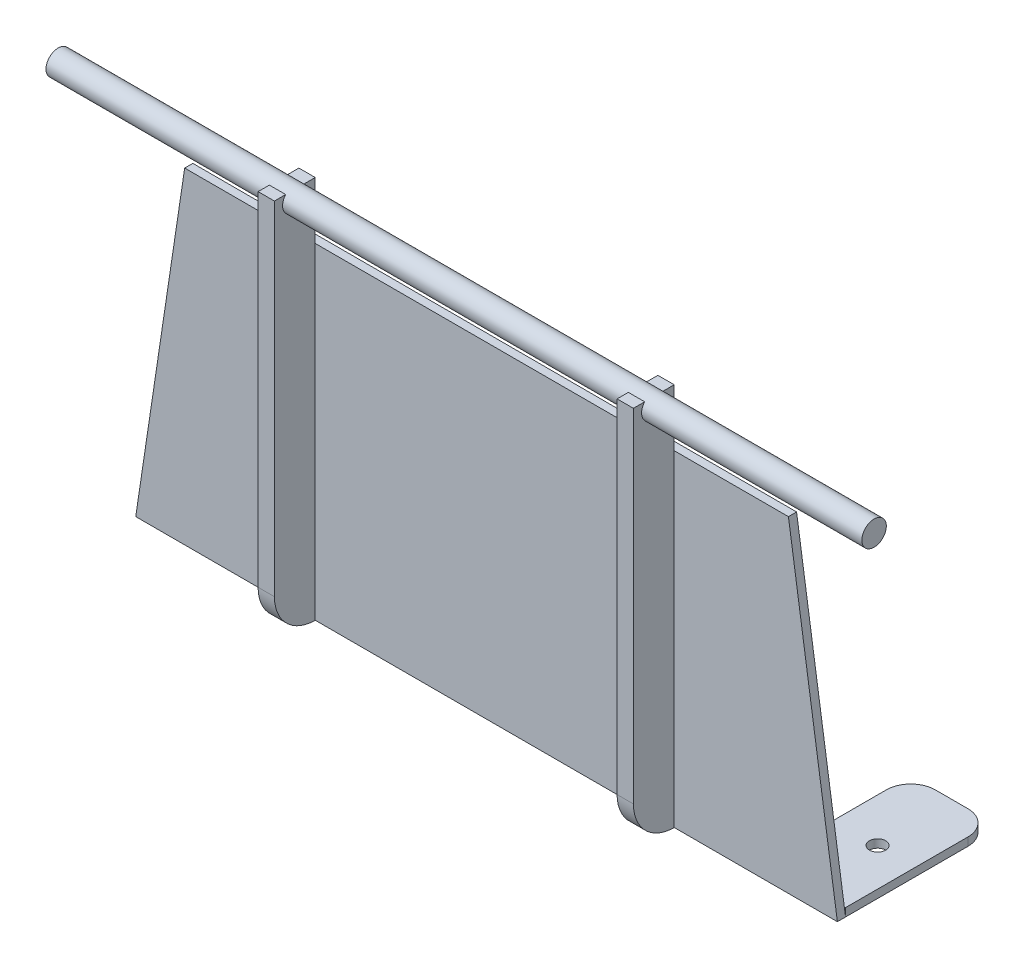
ISO-10303-21;
HEADER;
FILE_DESCRIPTION(('STEP AP214'),'2;1');
FILE_NAME('part.step','',(''),(''),'','','');
FILE_SCHEMA(('AUTOMOTIVE_DESIGN { 1 0 10303 214 1 1 1 1 }'));
ENDSEC;
DATA;
#1=APPLICATION_CONTEXT('core data for automotive mechanical design processes');
#2=APPLICATION_PROTOCOL_DEFINITION('international standard','automotive_design',2000,#1);
#3=PRODUCT_CONTEXT('',#1,'mechanical');
#4=PRODUCT('Part','Part','',(#3));
#5=PRODUCT_RELATED_PRODUCT_CATEGORY('part','',(#4));
#6=PRODUCT_DEFINITION_FORMATION('','',#4);
#7=PRODUCT_DEFINITION_CONTEXT('part definition',#1,'design');
#8=PRODUCT_DEFINITION('design','',#6,#7);
#9=PRODUCT_DEFINITION_SHAPE('','',#8);
#10=(LENGTH_UNIT() NAMED_UNIT(*) SI_UNIT(.MILLI.,.METRE.));
#11=(NAMED_UNIT(*) PLANE_ANGLE_UNIT() SI_UNIT($,.RADIAN.));
#12=(NAMED_UNIT(*) SI_UNIT($,.STERADIAN.) SOLID_ANGLE_UNIT());
#13=UNCERTAINTY_MEASURE_WITH_UNIT(LENGTH_MEASURE(1.E-05),#10,'distance_accuracy_value','');
#14=(GEOMETRIC_REPRESENTATION_CONTEXT(3) GLOBAL_UNCERTAINTY_ASSIGNED_CONTEXT((#13)) GLOBAL_UNIT_ASSIGNED_CONTEXT((#10,
#11,#12)) REPRESENTATION_CONTEXT('',''));
#15=CARTESIAN_POINT('',(0.,0.,0.));
#16=DIRECTION('',(0.,0.,1.));
#17=DIRECTION('',(1.,0.,0.));
#18=AXIS2_PLACEMENT_3D('',#15,#16,#17);
#19=CARTESIAN_POINT('',(0.,0.,0.));
#20=DIRECTION('',(0.,0.,1.));
#21=DIRECTION('',(1.,0.,0.));
#22=AXIS2_PLACEMENT_3D('',#19,#20,#21);
#23=PLANE('',#22);
#24=DIRECTION('',(-1.,0.,0.));
#25=VECTOR('',#24,1.);
#26=CARTESIAN_POINT('',(33.,1.,0.));
#27=LINE('',#26,#25);
#28=CARTESIAN_POINT('',(42.85,1.,0.));
#29=VERTEX_POINT('',#28);
#30=CARTESIAN_POINT('',(33.,1.,0.));
#31=VERTEX_POINT('',#30);
#32=EDGE_CURVE('E258',#29,#31,#27,.T.);
#33=ORIENTED_EDGE('',*,*,#32,.T.);
#34=DIRECTION('',(0.,-1.,0.));
#35=VECTOR('',#34,1.);
#36=CARTESIAN_POINT('',(33.,1.,0.));
#37=LINE('',#36,#35);
#38=CARTESIAN_POINT('',(33.,0.,0.));
#39=VERTEX_POINT('',#38);
#40=EDGE_CURVE('E253',#31,#39,#37,.T.);
#41=ORIENTED_EDGE('',*,*,#40,.T.);
#42=DIRECTION('',(1.,0.,0.));
#43=VECTOR('',#42,1.);
#44=CARTESIAN_POINT('',(-43.,0.,0.));
#45=LINE('',#44,#43);
#46=CARTESIAN_POINT('',(-33.,0.,0.));
#47=VERTEX_POINT('',#46);
#48=EDGE_CURVE('E458',#47,#39,#45,.T.);
#49=ORIENTED_EDGE('',*,*,#48,.F.);
#50=DIRECTION('',(0.,-1.,0.));
#51=VECTOR('',#50,1.);
#52=CARTESIAN_POINT('',(-33.,1.,0.));
#53=LINE('',#52,#51);
#54=CARTESIAN_POINT('',(-33.,1.,0.));
#55=VERTEX_POINT('',#54);
#56=EDGE_CURVE('E326',#55,#47,#53,.T.);
#57=ORIENTED_EDGE('',*,*,#56,.F.);
#58=DIRECTION('',(1.,0.,0.));
#59=VECTOR('',#58,1.);
#60=CARTESIAN_POINT('',(-33.,1.,0.));
#61=LINE('',#60,#59);
#62=CARTESIAN_POINT('',(-42.85,1.,0.));
#63=VERTEX_POINT('',#62);
#64=EDGE_CURVE('E302',#63,#55,#61,.T.);
#65=ORIENTED_EDGE('',*,*,#64,.F.);
#66=DIRECTION('',(-0.148340452930245,-0.988936352868298,0.));
#67=VECTOR('',#66,1.);
#68=CARTESIAN_POINT('',(-37.,40.,0.));
#69=LINE('',#68,#67);
#70=CARTESIAN_POINT('',(-37.,40.,0.));
#71=VERTEX_POINT('',#70);
#72=EDGE_CURVE('E454',#71,#63,#69,.T.);
#73=ORIENTED_EDGE('',*,*,#72,.F.);
#74=DIRECTION('',(-1.,0.,0.));
#75=VECTOR('',#74,1.);
#76=CARTESIAN_POINT('',(37.,40.,0.));
#77=LINE('',#76,#75);
#78=CARTESIAN_POINT('',(37.,40.,0.));
#79=VERTEX_POINT('',#78);
#80=EDGE_CURVE('E439',#79,#71,#77,.T.);
#81=ORIENTED_EDGE('',*,*,#80,.F.);
#82=DIRECTION('',(-0.148340452930245,0.988936352868298,0.));
#83=VECTOR('',#82,1.);
#84=CARTESIAN_POINT('',(37.,40.,0.));
#85=LINE('',#84,#83);
#86=EDGE_CURVE('E462',#29,#79,#85,.T.);
#87=ORIENTED_EDGE('',*,*,#86,.F.);
#88=EDGE_LOOP('',(#33,#41,#49,#57,#65,#73,#81,#87));
#89=FACE_BOUND('',#88,.T.);
#90=ADVANCED_FACE('F39',(#89),#23,.F.);
#91=CARTESIAN_POINT('',(23.,47.,1.00000000000001));
#92=DIRECTION('',(0.,-1.,0.));
#93=DIRECTION('',(0.,0.,-1.));
#94=AXIS2_PLACEMENT_3D('',#91,#92,#93);
#95=PLANE('',#94);
#96=DIRECTION('',(0.,0.,1.));
#97=VECTOR('',#96,1.);
#98=CARTESIAN_POINT('',(21.,47.,1.00000000000001));
#99=LINE('',#98,#97);
#100=CARTESIAN_POINT('',(21.,47.,1.00000000000001));
#101=VERTEX_POINT('',#100);
#102=CARTESIAN_POINT('',(21.,47.,2.38196601125011));
#103=VERTEX_POINT('',#102);
#104=EDGE_CURVE('E418',#101,#103,#99,.T.);
#105=ORIENTED_EDGE('',*,*,#104,.T.);
#106=DIRECTION('',(1.,0.,0.));
#107=VECTOR('',#106,1.);
#108=CARTESIAN_POINT('',(-50.,47.,2.38196601125011));
#109=LINE('',#108,#107);
#110=CARTESIAN_POINT('',(23.,47.,2.38196601125011));
#111=VERTEX_POINT('',#110);
#112=EDGE_CURVE('E357',#103,#111,#109,.T.);
#113=ORIENTED_EDGE('',*,*,#112,.T.);
#114=DIRECTION('',(0.,0.,1.));
#115=VECTOR('',#114,1.);
#116=CARTESIAN_POINT('',(23.,47.,1.00000000000001));
#117=LINE('',#116,#115);
#118=CARTESIAN_POINT('',(23.,47.,1.00000000000001));
#119=VERTEX_POINT('',#118);
#120=EDGE_CURVE('E405',#119,#111,#117,.T.);
#121=ORIENTED_EDGE('',*,*,#120,.F.);
#122=DIRECTION('',(-1.,0.,0.));
#123=VECTOR('',#122,1.);
#124=CARTESIAN_POINT('',(23.,47.,1.00000000000001));
#125=LINE('',#124,#123);
#126=EDGE_CURVE('E429',#119,#101,#125,.T.);
#127=ORIENTED_EDGE('',*,*,#126,.T.);
#128=EDGE_LOOP('',(#105,#113,#121,#127));
#129=FACE_BOUND('',#128,.T.);
#130=ADVANCED_FACE('F702',(#129),#95,.F.);
#131=CARTESIAN_POINT('',(-23.,47.,1.00000000000001));
#132=DIRECTION('',(0.,1.,0.));
#133=DIRECTION('',(0.,0.,1.));
#134=AXIS2_PLACEMENT_3D('',#131,#132,#133);
#135=PLANE('',#134);
#136=DIRECTION('',(1.,0.,0.));
#137=VECTOR('',#136,1.);
#138=CARTESIAN_POINT('',(-50.,47.,4.6180339887499));
#139=LINE('',#138,#137);
#140=CARTESIAN_POINT('',(-23.,47.,4.6180339887499));
#141=VERTEX_POINT('',#140);
#142=CARTESIAN_POINT('',(-21.,47.,4.6180339887499));
#143=VERTEX_POINT('',#142);
#144=EDGE_CURVE('E342',#141,#143,#139,.T.);
#145=ORIENTED_EDGE('',*,*,#144,.F.);
#146=DIRECTION('',(0.,0.,1.));
#147=VECTOR('',#146,1.);
#148=CARTESIAN_POINT('',(-23.,47.,1.00000000000001));
#149=LINE('',#148,#147);
#150=CARTESIAN_POINT('',(-23.,47.,6.));
#151=VERTEX_POINT('',#150);
#152=EDGE_CURVE('E368',#141,#151,#149,.T.);
#153=ORIENTED_EDGE('',*,*,#152,.T.);
#154=DIRECTION('',(1.,0.,0.));
#155=VECTOR('',#154,1.);
#156=CARTESIAN_POINT('',(-23.,47.,6.));
#157=LINE('',#156,#155);
#158=CARTESIAN_POINT('',(-21.,47.,6.));
#159=VERTEX_POINT('',#158);
#160=EDGE_CURVE('E394',#151,#159,#157,.T.);
#161=ORIENTED_EDGE('',*,*,#160,.T.);
#162=DIRECTION('',(0.,0.,1.));
#163=VECTOR('',#162,1.);
#164=CARTESIAN_POINT('',(-21.,47.,1.00000000000001));
#165=LINE('',#164,#163);
#166=EDGE_CURVE('E383',#143,#159,#165,.T.);
#167=ORIENTED_EDGE('',*,*,#166,.F.);
#168=EDGE_LOOP('',(#145,#153,#161,#167));
#169=FACE_BOUND('',#168,.T.);
#170=ADVANCED_FACE('F617',(#169),#135,.T.);
#171=CARTESIAN_POINT('',(0.,0.,1.));
#172=DIRECTION('',(0.,0.,1.));
#173=DIRECTION('',(1.,0.,0.));
#174=AXIS2_PLACEMENT_3D('',#171,#172,#173);
#175=PLANE('',#174);
#176=DIRECTION('',(1.,0.,0.));
#177=VECTOR('',#176,1.);
#178=CARTESIAN_POINT('',(-43.,0.,1.));
#179=LINE('',#178,#177);
#180=CARTESIAN_POINT('',(-43.,0.,1.));
#181=VERTEX_POINT('',#180);
#182=CARTESIAN_POINT('',(-23.,0.,1.));
#183=VERTEX_POINT('',#182);
#184=EDGE_CURVE('E440',#181,#183,#179,.T.);
#185=ORIENTED_EDGE('',*,*,#184,.T.);
#186=DIRECTION('',(0.,1.,0.));
#187=VECTOR('',#186,1.);
#188=CARTESIAN_POINT('',(-23.,47.,1.00000000000001));
#189=LINE('',#188,#187);
#190=CARTESIAN_POINT('',(-23.,40.,1.00000000000001));
#191=VERTEX_POINT('',#190);
#192=EDGE_CURVE('E375',#183,#191,#189,.T.);
#193=ORIENTED_EDGE('',*,*,#192,.T.);
#194=DIRECTION('',(-1.,0.,0.));
#195=VECTOR('',#194,1.);
#196=CARTESIAN_POINT('',(37.,40.,1.));
#197=LINE('',#196,#195);
#198=CARTESIAN_POINT('',(-37.,40.,1.));
#199=VERTEX_POINT('',#198);
#200=EDGE_CURVE('E448',#191,#199,#197,.T.);
#201=ORIENTED_EDGE('',*,*,#200,.T.);
#202=DIRECTION('',(-0.148340452930245,-0.988936352868298,0.));
#203=VECTOR('',#202,1.);
#204=CARTESIAN_POINT('',(-37.,40.,1.));
#205=LINE('',#204,#203);
#206=EDGE_CURVE('E434',#199,#181,#205,.T.);
#207=ORIENTED_EDGE('',*,*,#206,.T.);
#208=EDGE_LOOP('',(#185,#193,#201,#207));
#209=FACE_BOUND('',#208,.T.);
#210=ADVANCED_FACE('F645',(#209),#175,.T.);
#211=DIRECTION('',(0.,1.,0.));
#212=VECTOR('',#211,1.);
#213=CARTESIAN_POINT('',(-21.,47.,1.00000000000001));
#214=LINE('',#213,#212);
#215=CARTESIAN_POINT('',(-21.,0.,1.));
#216=VERTEX_POINT('',#215);
#217=CARTESIAN_POINT('',(-21.,40.,1.));
#218=VERTEX_POINT('',#217);
#219=EDGE_CURVE('E369',#216,#218,#214,.T.);
#220=ORIENTED_EDGE('',*,*,#219,.F.);
#221=CARTESIAN_POINT('',(21.,0.,1.));
#222=VERTEX_POINT('',#221);
#223=EDGE_CURVE('E445',#216,#222,#179,.T.);
#224=ORIENTED_EDGE('',*,*,#223,.T.);
#225=DIRECTION('',(0.,1.,0.));
#226=VECTOR('',#225,1.);
#227=CARTESIAN_POINT('',(21.,47.,1.00000000000001));
#228=LINE('',#227,#226);
#229=CARTESIAN_POINT('',(21.,40.,1.));
#230=VERTEX_POINT('',#229);
#231=EDGE_CURVE('E414',#222,#230,#228,.T.);
#232=ORIENTED_EDGE('',*,*,#231,.T.);
#233=EDGE_CURVE('E650',#230,#218,#197,.T.);
#234=ORIENTED_EDGE('',*,*,#233,.T.);
#235=EDGE_LOOP('',(#220,#224,#232,#234));
#236=FACE_BOUND('',#235,.T.);
#237=ADVANCED_FACE('F588',(#236),#175,.T.);
#238=CARTESIAN_POINT('',(-37.,40.,1.));
#239=DIRECTION('',(0.988936352868298,-0.148340452930245,0.));
#240=DIRECTION('',(0.148340452930245,0.988936352868298,0.));
#241=AXIS2_PLACEMENT_3D('',#238,#239,#240);
#242=PLANE('',#241);
#243=ORIENTED_EDGE('',*,*,#72,.T.);
#244=CARTESIAN_POINT('',(-43.,0.,0.));
#245=VERTEX_POINT('',#244);
#246=EDGE_CURVE('E433',#63,#245,#69,.T.);
#247=ORIENTED_EDGE('',*,*,#246,.T.);
#248=DIRECTION('',(0.,0.,-1.));
#249=VECTOR('',#248,1.);
#250=CARTESIAN_POINT('',(-43.,0.,1.));
#251=LINE('',#250,#249);
#252=EDGE_CURVE('E477',#181,#245,#251,.T.);
#253=ORIENTED_EDGE('',*,*,#252,.F.);
#254=ORIENTED_EDGE('',*,*,#206,.F.);
#255=DIRECTION('',(0.,0.,-1.));
#256=VECTOR('',#255,1.);
#257=CARTESIAN_POINT('',(-37.,40.,1.));
#258=LINE('',#257,#256);
#259=EDGE_CURVE('E452',#199,#71,#258,.T.);
#260=ORIENTED_EDGE('',*,*,#259,.T.);
#261=EDGE_LOOP('',(#243,#247,#253,#254,#260));
#262=FACE_BOUND('',#261,.T.);
#263=ADVANCED_FACE('F664',(#262),#242,.F.);
#264=CARTESIAN_POINT('',(-43.,0.,1.));
#265=DIRECTION('',(0.,1.,0.));
#266=DIRECTION('',(-1.,0.,0.));
#267=AXIS2_PLACEMENT_3D('',#264,#265,#266);
#268=PLANE('',#267);
#269=CARTESIAN_POINT('',(38.3643398282202,0.,-8.56066017177982));
#270=DIRECTION('',(0.,-1.,0.));
#271=DIRECTION('',(0.,0.,1.));
#272=AXIS2_PLACEMENT_3D('',#269,#270,#271);
#273=CIRCLE('',#272,0.999999999999998);
#274=CARTESIAN_POINT('',(38.3643398282202,0.,-7.56066017177983));
#275=VERTEX_POINT('',#274);
#276=EDGE_CURVE('E278',#275,#275,#273,.T.);
#277=ORIENTED_EDGE('',*,*,#276,.F.);
#278=EDGE_LOOP('',(#277));
#279=FACE_BOUND('',#278,.T.);
#280=CARTESIAN_POINT('',(-38.3643398282202,0.,-8.56066017177982));
#281=DIRECTION('',(0.,1.,0.));
#282=DIRECTION('',(0.,0.,1.));
#283=AXIS2_PLACEMENT_3D('',#280,#281,#282);
#284=CIRCLE('',#283,0.999999999999998);
#285=CARTESIAN_POINT('',(-38.3643398282202,0.,-7.56066017177983));
#286=VERTEX_POINT('',#285);
#287=EDGE_CURVE('E288',#286,#286,#284,.T.);
#288=ORIENTED_EDGE('',*,*,#287,.T.);
#289=EDGE_LOOP('',(#288));
#290=FACE_BOUND('',#289,.T.);
#291=DIRECTION('',(0.,0.,-1.));
#292=VECTOR('',#291,1.);
#293=CARTESIAN_POINT('',(33.,0.,-18.));
#294=LINE('',#293,#292);
#295=CARTESIAN_POINT('',(33.,0.,-15.));
#296=VERTEX_POINT('',#295);
#297=EDGE_CURVE('E263',#39,#296,#294,.T.);
#298=ORIENTED_EDGE('',*,*,#297,.T.);
#299=CARTESIAN_POINT('',(36.,0.,-15.));
#300=DIRECTION('',(0.,1.,0.));
#301=DIRECTION('',(-1.,0.,0.));
#302=AXIS2_PLACEMENT_3D('',#299,#300,#301);
#303=CIRCLE('',#302,3.);
#304=CARTESIAN_POINT('',(36.,0.,-18.));
#305=VERTEX_POINT('',#304);
#306=EDGE_CURVE('E544',#296,#305,#303,.F.);
#307=ORIENTED_EDGE('',*,*,#306,.T.);
#308=DIRECTION('',(1.,0.,0.));
#309=VECTOR('',#308,1.);
#310=CARTESIAN_POINT('',(43.,0.,-18.));
#311=LINE('',#310,#309);
#312=CARTESIAN_POINT('',(40.,0.,-18.));
#313=VERTEX_POINT('',#312);
#314=EDGE_CURVE('E277',#305,#313,#311,.T.);
#315=ORIENTED_EDGE('',*,*,#314,.T.);
#316=CARTESIAN_POINT('',(40.,0.,-15.));
#317=DIRECTION('',(0.,1.,0.));
#318=DIRECTION('',(-1.,0.,0.));
#319=AXIS2_PLACEMENT_3D('',#316,#317,#318);
#320=CIRCLE('',#319,3.);
#321=CARTESIAN_POINT('',(43.,0.,-15.));
#322=VERTEX_POINT('',#321);
#323=EDGE_CURVE('E541',#313,#322,#320,.F.);
#324=ORIENTED_EDGE('',*,*,#323,.T.);
#325=DIRECTION('',(0.,0.,1.));
#326=VECTOR('',#325,1.);
#327=CARTESIAN_POINT('',(43.,0.,0.));
#328=LINE('',#327,#326);
#329=CARTESIAN_POINT('',(43.,0.,0.));
#330=VERTEX_POINT('',#329);
#331=EDGE_CURVE('E274',#322,#330,#328,.T.);
#332=ORIENTED_EDGE('',*,*,#331,.T.);
#333=DIRECTION('',(0.,0.,-1.));
#334=VECTOR('',#333,1.);
#335=CARTESIAN_POINT('',(43.,0.,1.));
#336=LINE('',#335,#334);
#337=CARTESIAN_POINT('',(43.,0.,1.));
#338=VERTEX_POINT('',#337);
#339=EDGE_CURVE('E474',#338,#330,#336,.T.);
#340=ORIENTED_EDGE('',*,*,#339,.F.);
#341=CARTESIAN_POINT('',(23.,0.,1.));
#342=VERTEX_POINT('',#341);
#343=EDGE_CURVE('E438',#342,#338,#179,.T.);
#344=ORIENTED_EDGE('',*,*,#343,.F.);
#345=DIRECTION('',(-1.,0.,0.));
#346=VECTOR('',#345,1.);
#347=CARTESIAN_POINT('',(-43.,0.,1.));
#348=LINE('',#347,#346);
#349=EDGE_CURVE('E481',#342,#222,#348,.T.);
#350=ORIENTED_EDGE('',*,*,#349,.T.);
#351=ORIENTED_EDGE('',*,*,#223,.F.);
#352=DIRECTION('',(1.,0.,0.));
#353=VECTOR('',#352,1.);
#354=CARTESIAN_POINT('',(-23.,0.,1.));
#355=LINE('',#354,#353);
#356=EDGE_CURVE('E501',#216,#183,#355,.F.);
#357=ORIENTED_EDGE('',*,*,#356,.T.);
#358=ORIENTED_EDGE('',*,*,#184,.F.);
#359=ORIENTED_EDGE('',*,*,#252,.T.);
#360=DIRECTION('',(0.,0.,1.));
#361=VECTOR('',#360,1.);
#362=CARTESIAN_POINT('',(-43.,0.,0.));
#363=LINE('',#362,#361);
#364=CARTESIAN_POINT('',(-43.,0.,-15.));
#365=VERTEX_POINT('',#364);
#366=EDGE_CURVE('E301',#365,#245,#363,.T.);
#367=ORIENTED_EDGE('',*,*,#366,.F.);
#368=CARTESIAN_POINT('',(-40.,0.,-15.));
#369=DIRECTION('',(0.,1.,0.));
#370=DIRECTION('',(-1.,0.,0.));
#371=AXIS2_PLACEMENT_3D('',#368,#369,#370);
#372=CIRCLE('',#371,3.);
#373=CARTESIAN_POINT('',(-40.,0.,-18.));
#374=VERTEX_POINT('',#373);
#375=EDGE_CURVE('E518',#365,#374,#372,.F.);
#376=ORIENTED_EDGE('',*,*,#375,.T.);
#377=DIRECTION('',(-1.,0.,0.));
#378=VECTOR('',#377,1.);
#379=CARTESIAN_POINT('',(-43.,0.,-18.));
#380=LINE('',#379,#378);
#381=CARTESIAN_POINT('',(-36.,0.,-18.));
#382=VERTEX_POINT('',#381);
#383=EDGE_CURVE('E317',#382,#374,#380,.T.);
#384=ORIENTED_EDGE('',*,*,#383,.F.);
#385=CARTESIAN_POINT('',(-36.,0.,-15.));
#386=DIRECTION('',(0.,1.,0.));
#387=DIRECTION('',(-1.,0.,0.));
#388=AXIS2_PLACEMENT_3D('',#385,#386,#387);
#389=CIRCLE('',#388,3.);
#390=CARTESIAN_POINT('',(-33.,0.,-15.));
#391=VERTEX_POINT('',#390);
#392=EDGE_CURVE('E521',#382,#391,#389,.F.);
#393=ORIENTED_EDGE('',*,*,#392,.T.);
#394=DIRECTION('',(0.,0.,-1.));
#395=VECTOR('',#394,1.);
#396=CARTESIAN_POINT('',(-33.,0.,-18.));
#397=LINE('',#396,#395);
#398=EDGE_CURVE('E292',#47,#391,#397,.T.);
#399=ORIENTED_EDGE('',*,*,#398,.F.);
#400=ORIENTED_EDGE('',*,*,#48,.T.);
#401=EDGE_LOOP('',(#298,#307,#315,#324,#332,#340,#344,#350,#351,#357,#358,#359,#367,#376,#384,
#393,#399,#400));
#402=FACE_BOUND('',#401,.T.);
#403=ADVANCED_FACE('F565',(#279,#290,#402),#268,.F.);
#404=CARTESIAN_POINT('',(37.,40.,1.));
#405=DIRECTION('',(-0.988936352868298,-0.148340452930245,0.));
#406=DIRECTION('',(0.148340452930245,-0.988936352868298,0.));
#407=AXIS2_PLACEMENT_3D('',#404,#405,#406);
#408=PLANE('',#407);
#409=EDGE_CURVE('E250',#330,#29,#85,.T.);
#410=ORIENTED_EDGE('',*,*,#409,.T.);
#411=ORIENTED_EDGE('',*,*,#86,.T.);
#412=DIRECTION('',(0.,0.,-1.));
#413=VECTOR('',#412,1.);
#414=CARTESIAN_POINT('',(37.,40.,1.));
#415=LINE('',#414,#413);
#416=CARTESIAN_POINT('',(37.,40.,1.));
#417=VERTEX_POINT('',#416);
#418=EDGE_CURVE('E470',#417,#79,#415,.T.);
#419=ORIENTED_EDGE('',*,*,#418,.F.);
#420=DIRECTION('',(-0.148340452930245,0.988936352868298,0.));
#421=VECTOR('',#420,1.);
#422=CARTESIAN_POINT('',(37.,40.,1.));
#423=LINE('',#422,#421);
#424=EDGE_CURVE('E444',#338,#417,#423,.T.);
#425=ORIENTED_EDGE('',*,*,#424,.F.);
#426=ORIENTED_EDGE('',*,*,#339,.T.);
#427=EDGE_LOOP('',(#410,#411,#419,#425,#426));
#428=FACE_BOUND('',#427,.T.);
#429=ADVANCED_FACE('F576',(#428),#408,.F.);
#430=CARTESIAN_POINT('',(37.,40.,1.));
#431=DIRECTION('',(0.,-1.,0.));
#432=DIRECTION('',(1.,0.,0.));
#433=AXIS2_PLACEMENT_3D('',#430,#431,#432);
#434=PLANE('',#433);
#435=ORIENTED_EDGE('',*,*,#80,.T.);
#436=ORIENTED_EDGE('',*,*,#259,.F.);
#437=ORIENTED_EDGE('',*,*,#200,.F.);
#438=EDGE_CURVE('E647',#218,#191,#197,.T.);
#439=ORIENTED_EDGE('',*,*,#438,.F.);
#440=ORIENTED_EDGE('',*,*,#233,.F.);
#441=CARTESIAN_POINT('',(23.,40.,1.00000000000001));
#442=VERTEX_POINT('',#441);
#443=EDGE_CURVE('E453',#442,#230,#197,.T.);
#444=ORIENTED_EDGE('',*,*,#443,.F.);
#445=EDGE_CURVE('E449',#417,#442,#197,.T.);
#446=ORIENTED_EDGE('',*,*,#445,.F.);
#447=ORIENTED_EDGE('',*,*,#418,.T.);
#448=EDGE_LOOP('',(#435,#436,#437,#439,#440,#444,#446,#447));
#449=FACE_BOUND('',#448,.T.);
#450=ADVANCED_FACE('F656',(#449),#434,.F.);
#451=DIRECTION('',(0.,1.,0.));
#452=VECTOR('',#451,1.);
#453=CARTESIAN_POINT('',(23.,47.,1.00000000000001));
#454=LINE('',#453,#452);
#455=EDGE_CURVE('E399',#342,#442,#454,.T.);
#456=ORIENTED_EDGE('',*,*,#455,.F.);
#457=ORIENTED_EDGE('',*,*,#343,.T.);
#458=ORIENTED_EDGE('',*,*,#424,.T.);
#459=ORIENTED_EDGE('',*,*,#445,.T.);
#460=EDGE_LOOP('',(#456,#457,#458,#459));
#461=FACE_BOUND('',#460,.T.);
#462=ADVANCED_FACE('F580',(#461),#175,.T.);
#463=CARTESIAN_POINT('',(23.,47.,1.00000000000001));
#464=DIRECTION('',(0.,0.,1.));
#465=DIRECTION('',(0.,-1.,0.));
#466=AXIS2_PLACEMENT_3D('',#463,#464,#465);
#467=PLANE('',#466);
#468=EDGE_CURVE('E404',#442,#119,#454,.T.);
#469=ORIENTED_EDGE('',*,*,#468,.F.);
#470=ORIENTED_EDGE('',*,*,#443,.T.);
#471=EDGE_CURVE('E398',#230,#101,#228,.T.);
#472=ORIENTED_EDGE('',*,*,#471,.T.);
#473=ORIENTED_EDGE('',*,*,#126,.F.);
#474=EDGE_LOOP('',(#469,#470,#472,#473));
#475=FACE_BOUND('',#474,.T.);
#476=ADVANCED_FACE('F655',(#475),#467,.F.);
#477=CARTESIAN_POINT('',(23.,47.,4.6180339887499));
#478=VERTEX_POINT('',#477);
#479=CARTESIAN_POINT('',(23.,47.,6.));
#480=VERTEX_POINT('',#479);
#481=EDGE_CURVE('E403',#478,#480,#117,.T.);
#482=ORIENTED_EDGE('',*,*,#481,.F.);
#483=DIRECTION('',(1.,0.,0.));
#484=VECTOR('',#483,1.);
#485=CARTESIAN_POINT('',(-50.,47.,4.6180339887499));
#486=LINE('',#485,#484);
#487=CARTESIAN_POINT('',(21.,47.,4.6180339887499));
#488=VERTEX_POINT('',#487);
#489=EDGE_CURVE('E353',#478,#488,#486,.F.);
#490=ORIENTED_EDGE('',*,*,#489,.T.);
#491=CARTESIAN_POINT('',(21.,47.,6.));
#492=VERTEX_POINT('',#491);
#493=EDGE_CURVE('E417',#488,#492,#99,.T.);
#494=ORIENTED_EDGE('',*,*,#493,.T.);
#495=DIRECTION('',(-1.,0.,0.));
#496=VECTOR('',#495,1.);
#497=CARTESIAN_POINT('',(23.,47.,6.));
#498=LINE('',#497,#496);
#499=EDGE_CURVE('E413',#480,#492,#498,.T.);
#500=ORIENTED_EDGE('',*,*,#499,.F.);
#501=EDGE_LOOP('',(#482,#490,#494,#500));
#502=FACE_BOUND('',#501,.T.);
#503=ADVANCED_FACE('F709',(#502),#95,.F.);
#504=CARTESIAN_POINT('',(23.,0.,6.));
#505=DIRECTION('',(0.,0.,-1.));
#506=DIRECTION('',(-1.,0.,0.));
#507=AXIS2_PLACEMENT_3D('',#504,#505,#506);
#508=PLANE('',#507);
#509=DIRECTION('',(0.,-1.,0.));
#510=VECTOR('',#509,1.);
#511=CARTESIAN_POINT('',(21.,0.,6.));
#512=LINE('',#511,#510);
#513=CARTESIAN_POINT('',(21.,5.,6.));
#514=VERTEX_POINT('',#513);
#515=EDGE_CURVE('E422',#492,#514,#512,.T.);
#516=ORIENTED_EDGE('',*,*,#515,.T.);
#517=DIRECTION('',(-1.,0.,0.));
#518=VECTOR('',#517,1.);
#519=CARTESIAN_POINT('',(23.,5.,6.));
#520=LINE('',#519,#518);
#521=CARTESIAN_POINT('',(23.,5.,6.));
#522=VERTEX_POINT('',#521);
#523=EDGE_CURVE('E488',#514,#522,#520,.F.);
#524=ORIENTED_EDGE('',*,*,#523,.T.);
#525=DIRECTION('',(0.,-1.,0.));
#526=VECTOR('',#525,1.);
#527=CARTESIAN_POINT('',(23.,0.,6.));
#528=LINE('',#527,#526);
#529=EDGE_CURVE('E409',#480,#522,#528,.T.);
#530=ORIENTED_EDGE('',*,*,#529,.F.);
#531=ORIENTED_EDGE('',*,*,#499,.T.);
#532=EDGE_LOOP('',(#516,#524,#530,#531));
#533=FACE_BOUND('',#532,.T.);
#534=ADVANCED_FACE('F746',(#533),#508,.F.);
#535=CARTESIAN_POINT('',(23.,0.,0.));
#536=DIRECTION('',(-1.,0.,0.));
#537=DIRECTION('',(0.,0.,1.));
#538=AXIS2_PLACEMENT_3D('',#535,#536,#537);
#539=PLANE('',#538);
#540=ORIENTED_EDGE('',*,*,#120,.T.);
#541=CARTESIAN_POINT('',(23.,46.,3.5));
#542=DIRECTION('',(-1.,0.,0.));
#543=DIRECTION('',(0.,0.,1.));
#544=AXIS2_PLACEMENT_3D('',#541,#542,#543);
#545=CIRCLE('',#544,1.5);
#546=EDGE_CURVE('E360',#111,#478,#545,.T.);
#547=ORIENTED_EDGE('',*,*,#546,.T.);
#548=ORIENTED_EDGE('',*,*,#481,.T.);
#549=ORIENTED_EDGE('',*,*,#529,.T.);
#550=CARTESIAN_POINT('',(23.,5.,1.));
#551=DIRECTION('',(-1.,0.,0.));
#552=DIRECTION('',(0.,0.,1.));
#553=AXIS2_PLACEMENT_3D('',#550,#551,#552);
#554=CIRCLE('',#553,5.);
#555=EDGE_CURVE('E491',#522,#342,#554,.F.);
#556=ORIENTED_EDGE('',*,*,#555,.T.);
#557=ORIENTED_EDGE('',*,*,#455,.T.);
#558=ORIENTED_EDGE('',*,*,#468,.T.);
#559=EDGE_LOOP('',(#540,#547,#548,#549,#556,#557,#558));
#560=FACE_BOUND('',#559,.T.);
#561=ADVANCED_FACE('F743',(#560),#539,.F.);
#562=CARTESIAN_POINT('',(21.,0.,0.));
#563=DIRECTION('',(-1.,0.,0.));
#564=DIRECTION('',(0.,0.,1.));
#565=AXIS2_PLACEMENT_3D('',#562,#563,#564);
#566=PLANE('',#565);
#567=CARTESIAN_POINT('',(21.,46.,3.5));
#568=DIRECTION('',(-1.,0.,0.));
#569=DIRECTION('',(0.,0.,1.));
#570=AXIS2_PLACEMENT_3D('',#567,#568,#569);
#571=CIRCLE('',#570,1.5);
#572=EDGE_CURVE('E349',#103,#488,#571,.T.);
#573=ORIENTED_EDGE('',*,*,#572,.F.);
#574=ORIENTED_EDGE('',*,*,#104,.F.);
#575=ORIENTED_EDGE('',*,*,#471,.F.);
#576=ORIENTED_EDGE('',*,*,#231,.F.);
#577=CARTESIAN_POINT('',(21.,5.,1.));
#578=DIRECTION('',(-1.,0.,0.));
#579=DIRECTION('',(0.,0.,1.));
#580=AXIS2_PLACEMENT_3D('',#577,#578,#579);
#581=CIRCLE('',#580,5.);
#582=EDGE_CURVE('E485',#222,#514,#581,.T.);
#583=ORIENTED_EDGE('',*,*,#582,.T.);
#584=ORIENTED_EDGE('',*,*,#515,.F.);
#585=ORIENTED_EDGE('',*,*,#493,.F.);
#586=EDGE_LOOP('',(#573,#574,#575,#576,#583,#584,#585));
#587=FACE_BOUND('',#586,.T.);
#588=ADVANCED_FACE('F600',(#587),#566,.T.);
#589=CARTESIAN_POINT('',(-43.,5.,1.));
#590=DIRECTION('',(-1.,0.,0.));
#591=DIRECTION('',(0.,-1.,0.));
#592=AXIS2_PLACEMENT_3D('',#589,#590,#591);
#593=CYLINDRICAL_SURFACE('',#592,5.);
#594=ORIENTED_EDGE('',*,*,#555,.F.);
#595=ORIENTED_EDGE('',*,*,#523,.F.);
#596=ORIENTED_EDGE('',*,*,#582,.F.);
#597=ORIENTED_EDGE('',*,*,#349,.F.);
#598=EDGE_LOOP('',(#594,#595,#596,#597));
#599=FACE_BOUND('',#598,.T.);
#600=ADVANCED_FACE('F596',(#599),#593,.T.);
#601=CARTESIAN_POINT('',(-23.,47.,1.00000000000001));
#602=DIRECTION('',(0.,0.,-1.));
#603=DIRECTION('',(0.,1.,0.));
#604=AXIS2_PLACEMENT_3D('',#601,#602,#603);
#605=PLANE('',#604);
#606=ORIENTED_EDGE('',*,*,#438,.T.);
#607=CARTESIAN_POINT('',(-23.,47.,1.00000000000001));
#608=VERTEX_POINT('',#607);
#609=EDGE_CURVE('E374',#191,#608,#189,.T.);
#610=ORIENTED_EDGE('',*,*,#609,.T.);
#611=DIRECTION('',(1.,0.,0.));
#612=VECTOR('',#611,1.);
#613=CARTESIAN_POINT('',(-23.,47.,1.00000000000001));
#614=LINE('',#613,#612);
#615=CARTESIAN_POINT('',(-21.,47.,1.00000000000001));
#616=VERTEX_POINT('',#615);
#617=EDGE_CURVE('E379',#608,#616,#614,.T.);
#618=ORIENTED_EDGE('',*,*,#617,.T.);
#619=EDGE_CURVE('E387',#218,#616,#214,.T.);
#620=ORIENTED_EDGE('',*,*,#619,.F.);
#621=EDGE_LOOP('',(#606,#610,#618,#620));
#622=FACE_BOUND('',#621,.T.);
#623=ADVANCED_FACE('F632',(#622),#605,.T.);
#624=CARTESIAN_POINT('',(-23.,0.,6.));
#625=DIRECTION('',(0.,0.,1.));
#626=DIRECTION('',(1.,0.,0.));
#627=AXIS2_PLACEMENT_3D('',#624,#625,#626);
#628=PLANE('',#627);
#629=DIRECTION('',(0.,-1.,0.));
#630=VECTOR('',#629,1.);
#631=CARTESIAN_POINT('',(-23.,0.,6.));
#632=LINE('',#631,#630);
#633=CARTESIAN_POINT('',(-23.,5.,6.));
#634=VERTEX_POINT('',#633);
#635=EDGE_CURVE('E364',#151,#634,#632,.T.);
#636=ORIENTED_EDGE('',*,*,#635,.T.);
#637=DIRECTION('',(1.,0.,0.));
#638=VECTOR('',#637,1.);
#639=CARTESIAN_POINT('',(-21.,5.,6.));
#640=LINE('',#639,#638);
#641=CARTESIAN_POINT('',(-21.,5.,6.));
#642=VERTEX_POINT('',#641);
#643=EDGE_CURVE('E494',#634,#642,#640,.T.);
#644=ORIENTED_EDGE('',*,*,#643,.T.);
#645=DIRECTION('',(0.,-1.,0.));
#646=VECTOR('',#645,1.);
#647=CARTESIAN_POINT('',(-21.,0.,6.));
#648=LINE('',#647,#646);
#649=EDGE_CURVE('E363',#159,#642,#648,.T.);
#650=ORIENTED_EDGE('',*,*,#649,.F.);
#651=ORIENTED_EDGE('',*,*,#160,.F.);
#652=EDGE_LOOP('',(#636,#644,#650,#651));
#653=FACE_BOUND('',#652,.T.);
#654=ADVANCED_FACE('F621',(#653),#628,.T.);
#655=DIRECTION('',(1.,0.,0.));
#656=VECTOR('',#655,1.);
#657=CARTESIAN_POINT('',(-50.,47.,2.38196601125011));
#658=LINE('',#657,#656);
#659=CARTESIAN_POINT('',(-21.,47.,2.38196601125011));
#660=VERTEX_POINT('',#659);
#661=CARTESIAN_POINT('',(-23.,47.,2.38196601125011));
#662=VERTEX_POINT('',#661);
#663=EDGE_CURVE('E335',#660,#662,#658,.F.);
#664=ORIENTED_EDGE('',*,*,#663,.F.);
#665=EDGE_CURVE('E384',#616,#660,#165,.T.);
#666=ORIENTED_EDGE('',*,*,#665,.F.);
#667=ORIENTED_EDGE('',*,*,#617,.F.);
#668=EDGE_CURVE('E370',#608,#662,#149,.T.);
#669=ORIENTED_EDGE('',*,*,#668,.T.);
#670=EDGE_LOOP('',(#664,#666,#667,#669));
#671=FACE_BOUND('',#670,.T.);
#672=ADVANCED_FACE('F636',(#671),#135,.T.);
#673=CARTESIAN_POINT('',(-23.,0.,0.));
#674=DIRECTION('',(1.,0.,0.));
#675=DIRECTION('',(0.,0.,1.));
#676=AXIS2_PLACEMENT_3D('',#673,#674,#675);
#677=PLANE('',#676);
#678=ORIENTED_EDGE('',*,*,#152,.F.);
#679=CARTESIAN_POINT('',(-23.,46.,3.5));
#680=DIRECTION('',(1.,0.,0.));
#681=DIRECTION('',(0.,0.,-1.));
#682=AXIS2_PLACEMENT_3D('',#679,#680,#681);
#683=CIRCLE('',#682,1.5);
#684=EDGE_CURVE('E346',#141,#662,#683,.T.);
#685=ORIENTED_EDGE('',*,*,#684,.T.);
#686=ORIENTED_EDGE('',*,*,#668,.F.);
#687=ORIENTED_EDGE('',*,*,#609,.F.);
#688=ORIENTED_EDGE('',*,*,#192,.F.);
#689=CARTESIAN_POINT('',(-23.,5.,1.));
#690=DIRECTION('',(1.,0.,0.));
#691=DIRECTION('',(0.,0.,-1.));
#692=AXIS2_PLACEMENT_3D('',#689,#690,#691);
#693=CIRCLE('',#692,5.);
#694=EDGE_CURVE('E504',#183,#634,#693,.F.);
#695=ORIENTED_EDGE('',*,*,#694,.T.);
#696=ORIENTED_EDGE('',*,*,#635,.F.);
#697=EDGE_LOOP('',(#678,#685,#686,#687,#688,#695,#696));
#698=FACE_BOUND('',#697,.T.);
#699=ADVANCED_FACE('F642',(#698),#677,.F.);
#700=CARTESIAN_POINT('',(-21.,0.,0.));
#701=DIRECTION('',(1.,0.,0.));
#702=DIRECTION('',(0.,0.,1.));
#703=AXIS2_PLACEMENT_3D('',#700,#701,#702);
#704=PLANE('',#703);
#705=CARTESIAN_POINT('',(-21.,46.,3.5));
#706=DIRECTION('',(1.,0.,0.));
#707=DIRECTION('',(0.,0.,-1.));
#708=AXIS2_PLACEMENT_3D('',#705,#706,#707);
#709=CIRCLE('',#708,1.5);
#710=EDGE_CURVE('E507',#143,#660,#709,.T.);
#711=ORIENTED_EDGE('',*,*,#710,.F.);
#712=ORIENTED_EDGE('',*,*,#166,.T.);
#713=ORIENTED_EDGE('',*,*,#649,.T.);
#714=CARTESIAN_POINT('',(-21.,5.,1.));
#715=DIRECTION('',(1.,0.,0.));
#716=DIRECTION('',(0.,0.,-1.));
#717=AXIS2_PLACEMENT_3D('',#714,#715,#716);
#718=CIRCLE('',#717,5.);
#719=EDGE_CURVE('E498',#642,#216,#718,.T.);
#720=ORIENTED_EDGE('',*,*,#719,.T.);
#721=ORIENTED_EDGE('',*,*,#219,.T.);
#722=ORIENTED_EDGE('',*,*,#619,.T.);
#723=ORIENTED_EDGE('',*,*,#665,.T.);
#724=EDGE_LOOP('',(#711,#712,#713,#720,#721,#722,#723));
#725=FACE_BOUND('',#724,.T.);
#726=ADVANCED_FACE('F613',(#725),#704,.T.);
#727=CARTESIAN_POINT('',(-23.,5.,1.));
#728=DIRECTION('',(-1.,0.,0.));
#729=DIRECTION('',(0.,-1.,0.));
#730=AXIS2_PLACEMENT_3D('',#727,#728,#729);
#731=CYLINDRICAL_SURFACE('',#730,5.);
#732=ORIENTED_EDGE('',*,*,#694,.F.);
#733=ORIENTED_EDGE('',*,*,#356,.F.);
#734=ORIENTED_EDGE('',*,*,#719,.F.);
#735=ORIENTED_EDGE('',*,*,#643,.F.);
#736=EDGE_LOOP('',(#732,#733,#734,#735));
#737=FACE_BOUND('',#736,.T.);
#738=ADVANCED_FACE('F625',(#737),#731,.T.);
#739=CARTESIAN_POINT('',(-50.,46.,3.5));
#740=DIRECTION('',(1.,0.,0.));
#741=DIRECTION('',(0.,0.,-1.));
#742=AXIS2_PLACEMENT_3D('',#739,#740,#741);
#743=CYLINDRICAL_SURFACE('',#742,1.5);
#744=ORIENTED_EDGE('',*,*,#684,.F.);
#745=ORIENTED_EDGE('',*,*,#144,.T.);
#746=ORIENTED_EDGE('',*,*,#710,.T.);
#747=ORIENTED_EDGE('',*,*,#663,.T.);
#748=EDGE_LOOP('',(#744,#745,#746,#747));
#749=FACE_BOUND('',#748,.T.);
#750=CARTESIAN_POINT('',(-50.,46.,3.5));
#751=DIRECTION('',(1.,0.,0.));
#752=DIRECTION('',(0.,0.,-1.));
#753=AXIS2_PLACEMENT_3D('',#750,#751,#752);
#754=CIRCLE('',#753,1.5);
#755=CARTESIAN_POINT('',(-50.,46.,2.));
#756=VERTEX_POINT('',#755);
#757=EDGE_CURVE('E331',#756,#756,#754,.T.);
#758=ORIENTED_EDGE('',*,*,#757,.T.);
#759=EDGE_LOOP('',(#758));
#760=FACE_BOUND('',#759,.T.);
#761=CARTESIAN_POINT('',(50.,46.,3.5));
#762=DIRECTION('',(1.,0.,0.));
#763=DIRECTION('',(0.,0.,-1.));
#764=AXIS2_PLACEMENT_3D('',#761,#762,#763);
#765=CIRCLE('',#764,1.5);
#766=CARTESIAN_POINT('',(50.,46.,2.));
#767=VERTEX_POINT('',#766);
#768=EDGE_CURVE('E330',#767,#767,#765,.T.);
#769=ORIENTED_EDGE('',*,*,#768,.F.);
#770=EDGE_LOOP('',(#769));
#771=FACE_BOUND('',#770,.T.);
#772=ORIENTED_EDGE('',*,*,#546,.F.);
#773=ORIENTED_EDGE('',*,*,#112,.F.);
#774=ORIENTED_EDGE('',*,*,#572,.T.);
#775=ORIENTED_EDGE('',*,*,#489,.F.);
#776=EDGE_LOOP('',(#772,#773,#774,#775));
#777=FACE_BOUND('',#776,.T.);
#778=ADVANCED_FACE('F639',(#749,#760,#771,#777),#743,.T.);
#779=CARTESIAN_POINT('',(-50.,46.,3.5));
#780=DIRECTION('',(1.,0.,0.));
#781=DIRECTION('',(0.,0.,-1.));
#782=AXIS2_PLACEMENT_3D('',#779,#780,#781);
#783=PLANE('',#782);
#784=ORIENTED_EDGE('',*,*,#757,.F.);
#785=EDGE_LOOP('',(#784));
#786=FACE_BOUND('',#785,.T.);
#787=ADVANCED_FACE('F729',(#786),#783,.F.);
#788=CARTESIAN_POINT('',(50.,46.,3.5));
#789=DIRECTION('',(1.,0.,0.));
#790=DIRECTION('',(0.,0.,-1.));
#791=AXIS2_PLACEMENT_3D('',#788,#789,#790);
#792=PLANE('',#791);
#793=ORIENTED_EDGE('',*,*,#768,.T.);
#794=EDGE_LOOP('',(#793));
#795=FACE_BOUND('',#794,.T.);
#796=ADVANCED_FACE('F867',(#795),#792,.T.);
#797=CARTESIAN_POINT('',(-33.,1.,0.));
#798=DIRECTION('',(0.,0.,-1.));
#799=DIRECTION('',(-1.,0.,0.));
#800=AXIS2_PLACEMENT_3D('',#797,#798,#799);
#801=PLANE('',#800);
#802=ORIENTED_EDGE('',*,*,#246,.F.);
#803=CARTESIAN_POINT('',(-43.,1.,0.));
#804=VERTEX_POINT('',#803);
#805=EDGE_CURVE('E296',#804,#63,#61,.T.);
#806=ORIENTED_EDGE('',*,*,#805,.F.);
#807=DIRECTION('',(0.,-1.,0.));
#808=VECTOR('',#807,1.);
#809=CARTESIAN_POINT('',(-43.,1.,0.));
#810=LINE('',#809,#808);
#811=EDGE_CURVE('E313',#804,#245,#810,.T.);
#812=ORIENTED_EDGE('',*,*,#811,.T.);
#813=EDGE_LOOP('',(#802,#806,#812));
#814=FACE_BOUND('',#813,.T.);
#815=ADVANCED_FACE('F669',(#814),#801,.F.);
#816=CARTESIAN_POINT('',(-33.,1.,-18.));
#817=DIRECTION('',(-1.,0.,0.));
#818=DIRECTION('',(0.,0.,1.));
#819=AXIS2_PLACEMENT_3D('',#816,#817,#818);
#820=PLANE('',#819);
#821=ORIENTED_EDGE('',*,*,#398,.T.);
#822=DIRECTION('',(0.,-1.,0.));
#823=VECTOR('',#822,1.);
#824=CARTESIAN_POINT('',(-33.,1.,-15.));
#825=LINE('',#824,#823);
#826=CARTESIAN_POINT('',(-33.,1.,-15.));
#827=VERTEX_POINT('',#826);
#828=EDGE_CURVE('E524',#391,#827,#825,.F.);
#829=ORIENTED_EDGE('',*,*,#828,.T.);
#830=DIRECTION('',(0.,0.,-1.));
#831=VECTOR('',#830,1.);
#832=CARTESIAN_POINT('',(-33.,1.,-18.));
#833=LINE('',#832,#831);
#834=EDGE_CURVE('E300',#55,#827,#833,.T.);
#835=ORIENTED_EDGE('',*,*,#834,.F.);
#836=ORIENTED_EDGE('',*,*,#56,.T.);
#837=EDGE_LOOP('',(#821,#829,#835,#836));
#838=FACE_BOUND('',#837,.T.);
#839=ADVANCED_FACE('F885',(#838),#820,.F.);
#840=CARTESIAN_POINT('',(-43.,1.,-18.));
#841=DIRECTION('',(0.,0.,1.));
#842=DIRECTION('',(1.,0.,0.));
#843=AXIS2_PLACEMENT_3D('',#840,#841,#842);
#844=PLANE('',#843);
#845=DIRECTION('',(-1.,0.,0.));
#846=VECTOR('',#845,1.);
#847=CARTESIAN_POINT('',(-43.,1.,-18.));
#848=LINE('',#847,#846);
#849=CARTESIAN_POINT('',(-36.,1.,-18.));
#850=VERTEX_POINT('',#849);
#851=CARTESIAN_POINT('',(-40.,1.,-18.));
#852=VERTEX_POINT('',#851);
#853=EDGE_CURVE('E306',#850,#852,#848,.T.);
#854=ORIENTED_EDGE('',*,*,#853,.F.);
#855=DIRECTION('',(0.,-1.,0.));
#856=VECTOR('',#855,1.);
#857=CARTESIAN_POINT('',(-36.,1.,-18.));
#858=LINE('',#857,#856);
#859=EDGE_CURVE('E514',#850,#382,#858,.T.);
#860=ORIENTED_EDGE('',*,*,#859,.T.);
#861=ORIENTED_EDGE('',*,*,#383,.T.);
#862=DIRECTION('',(0.,-1.,0.));
#863=VECTOR('',#862,1.);
#864=CARTESIAN_POINT('',(-40.,1.,-18.));
#865=LINE('',#864,#863);
#866=EDGE_CURVE('E511',#374,#852,#865,.F.);
#867=ORIENTED_EDGE('',*,*,#866,.T.);
#868=EDGE_LOOP('',(#854,#860,#861,#867));
#869=FACE_BOUND('',#868,.T.);
#870=ADVANCED_FACE('F686',(#869),#844,.F.);
#871=CARTESIAN_POINT('',(-43.,1.,0.));
#872=DIRECTION('',(1.,0.,0.));
#873=DIRECTION('',(0.,0.,-1.));
#874=AXIS2_PLACEMENT_3D('',#871,#872,#873);
#875=PLANE('',#874);
#876=DIRECTION('',(0.,0.,1.));
#877=VECTOR('',#876,1.);
#878=CARTESIAN_POINT('',(-43.,1.,0.));
#879=LINE('',#878,#877);
#880=CARTESIAN_POINT('',(-43.,1.,-15.));
#881=VERTEX_POINT('',#880);
#882=EDGE_CURVE('E310',#881,#804,#879,.T.);
#883=ORIENTED_EDGE('',*,*,#882,.F.);
#884=DIRECTION('',(0.,-1.,0.));
#885=VECTOR('',#884,1.);
#886=CARTESIAN_POINT('',(-43.,1.,-15.));
#887=LINE('',#886,#885);
#888=EDGE_CURVE('E533',#881,#365,#887,.T.);
#889=ORIENTED_EDGE('',*,*,#888,.T.);
#890=ORIENTED_EDGE('',*,*,#366,.T.);
#891=ORIENTED_EDGE('',*,*,#811,.F.);
#892=EDGE_LOOP('',(#883,#889,#890,#891));
#893=FACE_BOUND('',#892,.T.);
#894=ADVANCED_FACE('F679',(#893),#875,.F.);
#895=CARTESIAN_POINT('',(0.,1.,0.));
#896=DIRECTION('',(0.,-1.,0.));
#897=DIRECTION('',(0.,0.,-1.));
#898=AXIS2_PLACEMENT_3D('',#895,#896,#897);
#899=PLANE('',#898);
#900=CARTESIAN_POINT('',(-38.3643398282202,1.,-8.56066017177982));
#901=DIRECTION('',(0.,1.,0.));
#902=DIRECTION('',(0.,0.,1.));
#903=AXIS2_PLACEMENT_3D('',#900,#901,#902);
#904=CIRCLE('',#903,0.999999999999998);
#905=CARTESIAN_POINT('',(-38.3643398282202,1.,-7.56066017177983));
#906=VERTEX_POINT('',#905);
#907=EDGE_CURVE('E252',#906,#906,#904,.T.);
#908=ORIENTED_EDGE('',*,*,#907,.F.);
#909=EDGE_LOOP('',(#908));
#910=FACE_BOUND('',#909,.T.);
#911=ORIENTED_EDGE('',*,*,#834,.T.);
#912=CARTESIAN_POINT('',(-36.,1.,-15.));
#913=DIRECTION('',(0.,-1.,0.));
#914=DIRECTION('',(0.,0.,-1.));
#915=AXIS2_PLACEMENT_3D('',#912,#913,#914);
#916=CIRCLE('',#915,3.);
#917=EDGE_CURVE('E530',#827,#850,#916,.F.);
#918=ORIENTED_EDGE('',*,*,#917,.T.);
#919=ORIENTED_EDGE('',*,*,#853,.T.);
#920=CARTESIAN_POINT('',(-40.,1.,-15.));
#921=DIRECTION('',(0.,-1.,0.));
#922=DIRECTION('',(0.,0.,-1.));
#923=AXIS2_PLACEMENT_3D('',#920,#921,#922);
#924=CIRCLE('',#923,3.);
#925=EDGE_CURVE('E527',#852,#881,#924,.F.);
#926=ORIENTED_EDGE('',*,*,#925,.T.);
#927=ORIENTED_EDGE('',*,*,#882,.T.);
#928=ORIENTED_EDGE('',*,*,#805,.T.);
#929=ORIENTED_EDGE('',*,*,#64,.T.);
#930=EDGE_LOOP('',(#911,#918,#919,#926,#927,#928,#929));
#931=FACE_BOUND('',#930,.T.);
#932=ADVANCED_FACE('F673',(#910,#931),#899,.F.);
#933=CARTESIAN_POINT('',(-36.,1.,-15.));
#934=DIRECTION('',(0.,-1.,0.));
#935=DIRECTION('',(0.,0.,-1.));
#936=AXIS2_PLACEMENT_3D('',#933,#934,#935);
#937=CYLINDRICAL_SURFACE('',#936,3.);
#938=ORIENTED_EDGE('',*,*,#917,.F.);
#939=ORIENTED_EDGE('',*,*,#828,.F.);
#940=ORIENTED_EDGE('',*,*,#392,.F.);
#941=ORIENTED_EDGE('',*,*,#859,.F.);
#942=EDGE_LOOP('',(#938,#939,#940,#941));
#943=FACE_BOUND('',#942,.T.);
#944=ADVANCED_FACE('F691',(#943),#937,.T.);
#945=CARTESIAN_POINT('',(-40.,1.,-15.));
#946=DIRECTION('',(0.,-1.,0.));
#947=DIRECTION('',(0.,0.,-1.));
#948=AXIS2_PLACEMENT_3D('',#945,#946,#947);
#949=CYLINDRICAL_SURFACE('',#948,3.);
#950=ORIENTED_EDGE('',*,*,#925,.F.);
#951=ORIENTED_EDGE('',*,*,#866,.F.);
#952=ORIENTED_EDGE('',*,*,#375,.F.);
#953=ORIENTED_EDGE('',*,*,#888,.F.);
#954=EDGE_LOOP('',(#950,#951,#952,#953));
#955=FACE_BOUND('',#954,.T.);
#956=ADVANCED_FACE('F688',(#955),#949,.T.);
#957=CARTESIAN_POINT('',(-38.3643398282202,0.,-8.56066017177982));
#958=DIRECTION('',(0.,1.,0.));
#959=DIRECTION('',(0.,0.,1.));
#960=AXIS2_PLACEMENT_3D('',#957,#958,#959);
#961=CYLINDRICAL_SURFACE('',#960,0.999999999999998);
#962=ORIENTED_EDGE('',*,*,#287,.F.);
#963=EDGE_LOOP('',(#962));
#964=FACE_BOUND('',#963,.T.);
#965=ORIENTED_EDGE('',*,*,#907,.T.);
#966=EDGE_LOOP('',(#965));
#967=FACE_BOUND('',#966,.T.);
#968=ADVANCED_FACE('F690',(#964,#967),#961,.F.);
#969=CARTESIAN_POINT('',(33.,1.,0.));
#970=DIRECTION('',(0.,0.,1.));
#971=DIRECTION('',(1.,0.,0.));
#972=AXIS2_PLACEMENT_3D('',#969,#970,#971);
#973=PLANE('',#972);
#974=ORIENTED_EDGE('',*,*,#409,.F.);
#975=DIRECTION('',(0.,-1.,0.));
#976=VECTOR('',#975,1.);
#977=CARTESIAN_POINT('',(43.,1.,0.));
#978=LINE('',#977,#976);
#979=CARTESIAN_POINT('',(43.,1.,0.));
#980=VERTEX_POINT('',#979);
#981=EDGE_CURVE('E238',#980,#330,#978,.T.);
#982=ORIENTED_EDGE('',*,*,#981,.F.);
#983=EDGE_CURVE('E243',#980,#29,#27,.T.);
#984=ORIENTED_EDGE('',*,*,#983,.T.);
#985=EDGE_LOOP('',(#974,#982,#984));
#986=FACE_BOUND('',#985,.T.);
#987=ADVANCED_FACE('F247',(#986),#973,.T.);
#988=CARTESIAN_POINT('',(43.,1.,0.));
#989=DIRECTION('',(1.,0.,0.));
#990=DIRECTION('',(0.,0.,-1.));
#991=AXIS2_PLACEMENT_3D('',#988,#989,#990);
#992=PLANE('',#991);
#993=ORIENTED_EDGE('',*,*,#331,.F.);
#994=DIRECTION('',(0.,-1.,0.));
#995=VECTOR('',#994,1.);
#996=CARTESIAN_POINT('',(43.,1.,-15.));
#997=LINE('',#996,#995);
#998=CARTESIAN_POINT('',(43.,1.,-15.));
#999=VERTEX_POINT('',#998);
#1000=EDGE_CURVE('E11',#322,#999,#997,.F.);
#1001=ORIENTED_EDGE('',*,*,#1000,.T.);
#1002=DIRECTION('',(0.,0.,1.));
#1003=VECTOR('',#1002,1.);
#1004=CARTESIAN_POINT('',(43.,1.,0.));
#1005=LINE('',#1004,#1003);
#1006=EDGE_CURVE('E235',#999,#980,#1005,.T.);
#1007=ORIENTED_EDGE('',*,*,#1006,.T.);
#1008=ORIENTED_EDGE('',*,*,#981,.T.);
#1009=EDGE_LOOP('',(#993,#1001,#1007,#1008));
#1010=FACE_BOUND('',#1009,.T.);
#1011=ADVANCED_FACE('F237',(#1010),#992,.T.);
#1012=CARTESIAN_POINT('',(43.,1.,-18.));
#1013=DIRECTION('',(0.,0.,-1.));
#1014=DIRECTION('',(-1.,0.,0.));
#1015=AXIS2_PLACEMENT_3D('',#1012,#1013,#1014);
#1016=PLANE('',#1015);
#1017=ORIENTED_EDGE('',*,*,#314,.F.);
#1018=DIRECTION('',(0.,-1.,0.));
#1019=VECTOR('',#1018,1.);
#1020=CARTESIAN_POINT('',(36.,1.,-18.));
#1021=LINE('',#1020,#1019);
#1022=CARTESIAN_POINT('',(36.,1.,-18.));
#1023=VERTEX_POINT('',#1022);
#1024=EDGE_CURVE('E551',#305,#1023,#1021,.F.);
#1025=ORIENTED_EDGE('',*,*,#1024,.T.);
#1026=DIRECTION('',(1.,0.,0.));
#1027=VECTOR('',#1026,1.);
#1028=CARTESIAN_POINT('',(43.,1.,-18.));
#1029=LINE('',#1028,#1027);
#1030=CARTESIAN_POINT('',(40.,1.,-18.));
#1031=VERTEX_POINT('',#1030);
#1032=EDGE_CURVE('E242',#1023,#1031,#1029,.T.);
#1033=ORIENTED_EDGE('',*,*,#1032,.T.);
#1034=DIRECTION('',(0.,-1.,0.));
#1035=VECTOR('',#1034,1.);
#1036=CARTESIAN_POINT('',(40.,1.,-18.));
#1037=LINE('',#1036,#1035);
#1038=EDGE_CURVE('E547',#1031,#313,#1037,.T.);
#1039=ORIENTED_EDGE('',*,*,#1038,.T.);
#1040=EDGE_LOOP('',(#1017,#1025,#1033,#1039));
#1041=FACE_BOUND('',#1040,.T.);
#1042=ADVANCED_FACE('F567',(#1041),#1016,.T.);
#1043=CARTESIAN_POINT('',(33.,1.,-18.));
#1044=DIRECTION('',(-1.,0.,0.));
#1045=DIRECTION('',(0.,0.,1.));
#1046=AXIS2_PLACEMENT_3D('',#1043,#1044,#1045);
#1047=PLANE('',#1046);
#1048=DIRECTION('',(0.,0.,-1.));
#1049=VECTOR('',#1048,1.);
#1050=CARTESIAN_POINT('',(33.,1.,-18.));
#1051=LINE('',#1050,#1049);
#1052=CARTESIAN_POINT('',(33.,1.,-15.));
#1053=VERTEX_POINT('',#1052);
#1054=EDGE_CURVE('E270',#31,#1053,#1051,.T.);
#1055=ORIENTED_EDGE('',*,*,#1054,.T.);
#1056=DIRECTION('',(0.,-1.,0.));
#1057=VECTOR('',#1056,1.);
#1058=CARTESIAN_POINT('',(33.,1.,-15.));
#1059=LINE('',#1058,#1057);
#1060=EDGE_CURVE('E537',#1053,#296,#1059,.T.);
#1061=ORIENTED_EDGE('',*,*,#1060,.T.);
#1062=ORIENTED_EDGE('',*,*,#297,.F.);
#1063=ORIENTED_EDGE('',*,*,#40,.F.);
#1064=EDGE_LOOP('',(#1055,#1061,#1062,#1063));
#1065=FACE_BOUND('',#1064,.T.);
#1066=ADVANCED_FACE('F561',(#1065),#1047,.T.);
#1067=CARTESIAN_POINT('',(0.,1.,0.));
#1068=DIRECTION('',(0.,-1.,0.));
#1069=DIRECTION('',(0.,0.,-1.));
#1070=AXIS2_PLACEMENT_3D('',#1067,#1068,#1069);
#1071=PLANE('',#1070);
#1072=CARTESIAN_POINT('',(38.3643398282202,1.,-8.56066017177982));
#1073=DIRECTION('',(0.,-1.,0.));
#1074=DIRECTION('',(0.,0.,1.));
#1075=AXIS2_PLACEMENT_3D('',#1072,#1073,#1074);
#1076=CIRCLE('',#1075,0.999999999999998);
#1077=CARTESIAN_POINT('',(38.3643398282202,1.,-7.56066017177983));
#1078=VERTEX_POINT('',#1077);
#1079=EDGE_CURVE('E265',#1078,#1078,#1076,.T.);
#1080=ORIENTED_EDGE('',*,*,#1079,.T.);
#1081=EDGE_LOOP('',(#1080));
#1082=FACE_BOUND('',#1081,.T.);
#1083=ORIENTED_EDGE('',*,*,#1032,.F.);
#1084=CARTESIAN_POINT('',(36.,1.,-15.));
#1085=DIRECTION('',(0.,-1.,0.));
#1086=DIRECTION('',(0.,0.,-1.));
#1087=AXIS2_PLACEMENT_3D('',#1084,#1085,#1086);
#1088=CIRCLE('',#1087,3.);
#1089=EDGE_CURVE('E48',#1023,#1053,#1088,.F.);
#1090=ORIENTED_EDGE('',*,*,#1089,.T.);
#1091=ORIENTED_EDGE('',*,*,#1054,.F.);
#1092=ORIENTED_EDGE('',*,*,#32,.F.);
#1093=ORIENTED_EDGE('',*,*,#983,.F.);
#1094=ORIENTED_EDGE('',*,*,#1006,.F.);
#1095=CARTESIAN_POINT('',(40.,1.,-15.));
#1096=DIRECTION('',(0.,-1.,0.));
#1097=DIRECTION('',(0.,0.,-1.));
#1098=AXIS2_PLACEMENT_3D('',#1095,#1096,#1097);
#1099=CIRCLE('',#1098,3.);
#1100=EDGE_CURVE('E60',#999,#1031,#1099,.F.);
#1101=ORIENTED_EDGE('',*,*,#1100,.T.);
#1102=EDGE_LOOP('',(#1083,#1090,#1091,#1092,#1093,#1094,#1101));
#1103=FACE_BOUND('',#1102,.T.);
#1104=ADVANCED_FACE('F255',(#1082,#1103),#1071,.F.);
#1105=CARTESIAN_POINT('',(36.,1.,-15.));
#1106=DIRECTION('',(0.,-1.,0.));
#1107=DIRECTION('',(0.,0.,-1.));
#1108=AXIS2_PLACEMENT_3D('',#1105,#1106,#1107);
#1109=CYLINDRICAL_SURFACE('',#1108,3.);
#1110=ORIENTED_EDGE('',*,*,#1089,.F.);
#1111=ORIENTED_EDGE('',*,*,#1024,.F.);
#1112=ORIENTED_EDGE('',*,*,#306,.F.);
#1113=ORIENTED_EDGE('',*,*,#1060,.F.);
#1114=EDGE_LOOP('',(#1110,#1111,#1112,#1113));
#1115=FACE_BOUND('',#1114,.T.);
#1116=ADVANCED_FACE('F562',(#1115),#1109,.T.);
#1117=CARTESIAN_POINT('',(40.,1.,-15.));
#1118=DIRECTION('',(0.,-1.,0.));
#1119=DIRECTION('',(0.,0.,-1.));
#1120=AXIS2_PLACEMENT_3D('',#1117,#1118,#1119);
#1121=CYLINDRICAL_SURFACE('',#1120,3.);
#1122=ORIENTED_EDGE('',*,*,#1100,.F.);
#1123=ORIENTED_EDGE('',*,*,#1000,.F.);
#1124=ORIENTED_EDGE('',*,*,#323,.F.);
#1125=ORIENTED_EDGE('',*,*,#1038,.F.);
#1126=EDGE_LOOP('',(#1122,#1123,#1124,#1125));
#1127=FACE_BOUND('',#1126,.T.);
#1128=ADVANCED_FACE('F41',(#1127),#1121,.T.);
#1129=CARTESIAN_POINT('',(38.3643398282202,0.,-8.56066017177982));
#1130=DIRECTION('',(0.,1.,0.));
#1131=DIRECTION('',(0.,0.,1.));
#1132=AXIS2_PLACEMENT_3D('',#1129,#1130,#1131);
#1133=CYLINDRICAL_SURFACE('',#1132,0.999999999999998);
#1134=ORIENTED_EDGE('',*,*,#276,.T.);
#1135=EDGE_LOOP('',(#1134));
#1136=FACE_BOUND('',#1135,.T.);
#1137=ORIENTED_EDGE('',*,*,#1079,.F.);
#1138=EDGE_LOOP('',(#1137));
#1139=FACE_BOUND('',#1138,.T.);
#1140=ADVANCED_FACE('F981',(#1136,#1139),#1133,.F.);
#1141=CLOSED_SHELL('',(#90,#130,#170,#210,#237,#263,#403,#429,#450,#462,#476,#503,#534,#561,
#588,#600,#623,#654,#672,#699,#726,#738,#778,#787,#796,#815,#839,#870,#894,#932,#944,#956,#968,
#987,#1011,#1042,#1066,#1104,#1116,#1128,#1140));
#1142=MANIFOLD_SOLID_BREP('B2',#1141);
#1143=ADVANCED_BREP_SHAPE_REPRESENTATION('',(#18,#1142),#14);
#1144=SHAPE_DEFINITION_REPRESENTATION(#9,#1143);
ENDSEC;
END-ISO-10303-21;
